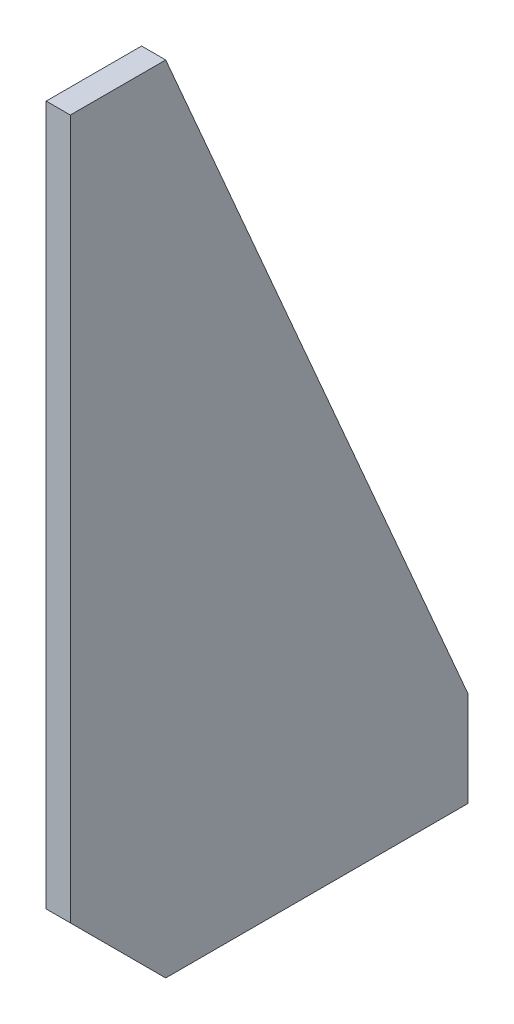
ISO-10303-21;
HEADER;
FILE_DESCRIPTION(('STEP AP214'),'2;1');
FILE_NAME('part.step','',(''),(''),'','','');
FILE_SCHEMA(('AUTOMOTIVE_DESIGN { 1 0 10303 214 1 1 1 1 }'));
ENDSEC;
DATA;
#1=APPLICATION_CONTEXT('core data for automotive mechanical design processes');
#2=APPLICATION_PROTOCOL_DEFINITION('international standard','automotive_design',2000,#1);
#3=PRODUCT_CONTEXT('',#1,'mechanical');
#4=PRODUCT('Part','Part','',(#3));
#5=PRODUCT_RELATED_PRODUCT_CATEGORY('part','',(#4));
#6=PRODUCT_DEFINITION_FORMATION('','',#4);
#7=PRODUCT_DEFINITION_CONTEXT('part definition',#1,'design');
#8=PRODUCT_DEFINITION('design','',#6,#7);
#9=PRODUCT_DEFINITION_SHAPE('','',#8);
#10=(LENGTH_UNIT() NAMED_UNIT(*) SI_UNIT(.MILLI.,.METRE.));
#11=(NAMED_UNIT(*) PLANE_ANGLE_UNIT() SI_UNIT($,.RADIAN.));
#12=(NAMED_UNIT(*) SI_UNIT($,.STERADIAN.) SOLID_ANGLE_UNIT());
#13=UNCERTAINTY_MEASURE_WITH_UNIT(LENGTH_MEASURE(1.E-05),#10,'distance_accuracy_value','');
#14=(GEOMETRIC_REPRESENTATION_CONTEXT(3) GLOBAL_UNCERTAINTY_ASSIGNED_CONTEXT((#13)) GLOBAL_UNIT_ASSIGNED_CONTEXT((#10,
#11,#12)) REPRESENTATION_CONTEXT('',''));
#15=CARTESIAN_POINT('',(0.,0.,0.));
#16=DIRECTION('',(0.,0.,1.));
#17=DIRECTION('',(1.,0.,0.));
#18=AXIS2_PLACEMENT_3D('',#15,#16,#17);
#19=CARTESIAN_POINT('',(-3.03784,0.,-50.));
#20=DIRECTION('',(0.,-1.,0.));
#21=DIRECTION('',(0.,0.,-1.));
#22=AXIS2_PLACEMENT_3D('',#19,#20,#21);
#23=PLANE('',#22);
#24=DIRECTION('',(0.,0.,-1.));
#25=VECTOR('',#24,1.);
#26=CARTESIAN_POINT('',(0.,0.,-50.));
#27=LINE('',#26,#25);
#28=CARTESIAN_POINT('',(0.,0.,-12.));
#29=VERTEX_POINT('',#28);
#30=CARTESIAN_POINT('',(0.,0.,-50.));
#31=VERTEX_POINT('',#30);
#32=EDGE_CURVE('E123',#29,#31,#27,.T.);
#33=ORIENTED_EDGE('',*,*,#32,.F.);
#34=DIRECTION('',(1.,0.,0.));
#35=VECTOR('',#34,1.);
#36=CARTESIAN_POINT('',(-3.03784,0.,-12.));
#37=LINE('',#36,#35);
#38=CARTESIAN_POINT('',(-3.03784,0.,-12.));
#39=VERTEX_POINT('',#38);
#40=EDGE_CURVE('E11',#39,#29,#37,.T.);
#41=ORIENTED_EDGE('',*,*,#40,.F.);
#42=DIRECTION('',(0.,0.,-1.));
#43=VECTOR('',#42,1.);
#44=CARTESIAN_POINT('',(-3.03784,0.,-50.));
#45=LINE('',#44,#43);
#46=CARTESIAN_POINT('',(-3.03784,0.,-50.));
#47=VERTEX_POINT('',#46);
#48=EDGE_CURVE('E137',#39,#47,#45,.T.);
#49=ORIENTED_EDGE('',*,*,#48,.T.);
#50=DIRECTION('',(1.,0.,0.));
#51=VECTOR('',#50,1.);
#52=CARTESIAN_POINT('',(-3.03784,0.,-50.));
#53=LINE('',#52,#51);
#54=EDGE_CURVE('E41',#47,#31,#53,.T.);
#55=ORIENTED_EDGE('',*,*,#54,.T.);
#56=EDGE_LOOP('',(#33,#41,#49,#55));
#57=FACE_BOUND('',#56,.T.);
#58=ADVANCED_FACE('F38',(#57),#23,.T.);
#59=CARTESIAN_POINT('',(-3.03784,0.,-12.));
#60=DIRECTION('',(0.,-0.707106781186547,0.707106781186548));
#61=DIRECTION('',(0.,-0.707106781186548,-0.707106781186547));
#62=AXIS2_PLACEMENT_3D('',#59,#60,#61);
#63=PLANE('',#62);
#64=DIRECTION('',(0.,-0.707106781186548,-0.707106781186547));
#65=VECTOR('',#64,1.);
#66=CARTESIAN_POINT('',(0.,0.,-12.));
#67=LINE('',#66,#65);
#68=CARTESIAN_POINT('',(0.,12.,0.));
#69=VERTEX_POINT('',#68);
#70=EDGE_CURVE('E135',#69,#29,#67,.T.);
#71=ORIENTED_EDGE('',*,*,#70,.F.);
#72=DIRECTION('',(1.,0.,0.));
#73=VECTOR('',#72,1.);
#74=CARTESIAN_POINT('',(-3.03784,12.,0.));
#75=LINE('',#74,#73);
#76=CARTESIAN_POINT('',(-3.03784,12.,0.));
#77=VERTEX_POINT('',#76);
#78=EDGE_CURVE('E47',#77,#69,#75,.T.);
#79=ORIENTED_EDGE('',*,*,#78,.F.);
#80=DIRECTION('',(0.,-0.707106781186548,-0.707106781186547));
#81=VECTOR('',#80,1.);
#82=CARTESIAN_POINT('',(-3.03784,0.,-12.));
#83=LINE('',#82,#81);
#84=EDGE_CURVE('E113',#77,#39,#83,.T.);
#85=ORIENTED_EDGE('',*,*,#84,.T.);
#86=ORIENTED_EDGE('',*,*,#40,.T.);
#87=EDGE_LOOP('',(#71,#79,#85,#86));
#88=FACE_BOUND('',#87,.T.);
#89=ADVANCED_FACE('F145',(#88),#63,.T.);
#90=CARTESIAN_POINT('',(-3.03784,12.,0.));
#91=DIRECTION('',(0.,0.,1.));
#92=DIRECTION('',(1.,0.,0.));
#93=AXIS2_PLACEMENT_3D('',#90,#91,#92);
#94=PLANE('',#93);
#95=DIRECTION('',(0.,-1.,0.));
#96=VECTOR('',#95,1.);
#97=CARTESIAN_POINT('',(0.,12.,0.));
#98=LINE('',#97,#96);
#99=CARTESIAN_POINT('',(0.,100.,0.));
#100=VERTEX_POINT('',#99);
#101=EDGE_CURVE('E100',#100,#69,#98,.T.);
#102=ORIENTED_EDGE('',*,*,#101,.F.);
#103=DIRECTION('',(1.,0.,0.));
#104=VECTOR('',#103,1.);
#105=CARTESIAN_POINT('',(-3.03784,100.,0.));
#106=LINE('',#105,#104);
#107=CARTESIAN_POINT('',(-3.03784,100.,0.));
#108=VERTEX_POINT('',#107);
#109=EDGE_CURVE('E95',#108,#100,#106,.T.);
#110=ORIENTED_EDGE('',*,*,#109,.F.);
#111=DIRECTION('',(0.,-1.,0.));
#112=VECTOR('',#111,1.);
#113=CARTESIAN_POINT('',(-3.03784,12.,0.));
#114=LINE('',#113,#112);
#115=EDGE_CURVE('E98',#108,#77,#114,.T.);
#116=ORIENTED_EDGE('',*,*,#115,.T.);
#117=ORIENTED_EDGE('',*,*,#78,.T.);
#118=EDGE_LOOP('',(#102,#110,#116,#117));
#119=FACE_BOUND('',#118,.T.);
#120=ADVANCED_FACE('F97',(#119),#94,.T.);
#121=CARTESIAN_POINT('',(-3.03784,100.,0.));
#122=DIRECTION('',(0.,1.,0.));
#123=DIRECTION('',(0.,0.,1.));
#124=AXIS2_PLACEMENT_3D('',#121,#122,#123);
#125=PLANE('',#124);
#126=DIRECTION('',(0.,0.,1.));
#127=VECTOR('',#126,1.);
#128=CARTESIAN_POINT('',(0.,100.,0.));
#129=LINE('',#128,#127);
#130=CARTESIAN_POINT('',(0.,100.,-12.));
#131=VERTEX_POINT('',#130);
#132=EDGE_CURVE('E132',#131,#100,#129,.T.);
#133=ORIENTED_EDGE('',*,*,#132,.F.);
#134=DIRECTION('',(1.,0.,0.));
#135=VECTOR('',#134,1.);
#136=CARTESIAN_POINT('',(-3.03784,100.,-12.));
#137=LINE('',#136,#135);
#138=CARTESIAN_POINT('',(-3.03784,100.,-12.));
#139=VERTEX_POINT('',#138);
#140=EDGE_CURVE('E105',#139,#131,#137,.T.);
#141=ORIENTED_EDGE('',*,*,#140,.F.);
#142=DIRECTION('',(0.,0.,1.));
#143=VECTOR('',#142,1.);
#144=CARTESIAN_POINT('',(-3.03784,100.,0.));
#145=LINE('',#144,#143);
#146=EDGE_CURVE('E111',#139,#108,#145,.T.);
#147=ORIENTED_EDGE('',*,*,#146,.T.);
#148=ORIENTED_EDGE('',*,*,#109,.T.);
#149=EDGE_LOOP('',(#133,#141,#147,#148));
#150=FACE_BOUND('',#149,.T.);
#151=ADVANCED_FACE('F115',(#150),#125,.T.);
#152=CARTESIAN_POINT('',(-3.03784,100.,-12.));
#153=DIRECTION('',(0.,0.396436016299719,-0.91806235353619));
#154=DIRECTION('',(0.,0.91806235353619,0.396436016299719));
#155=AXIS2_PLACEMENT_3D('',#152,#153,#154);
#156=PLANE('',#155);
#157=DIRECTION('',(0.,0.91806235353619,0.396436016299719));
#158=VECTOR('',#157,1.);
#159=CARTESIAN_POINT('',(0.,100.,-12.));
#160=LINE('',#159,#158);
#161=CARTESIAN_POINT('',(0.,12.,-50.));
#162=VERTEX_POINT('',#161);
#163=EDGE_CURVE('E129',#162,#131,#160,.T.);
#164=ORIENTED_EDGE('',*,*,#163,.F.);
#165=DIRECTION('',(1.,0.,0.));
#166=VECTOR('',#165,1.);
#167=CARTESIAN_POINT('',(-3.03784,12.,-50.));
#168=LINE('',#167,#166);
#169=CARTESIAN_POINT('',(-3.03784,12.,-50.));
#170=VERTEX_POINT('',#169);
#171=EDGE_CURVE('E140',#170,#162,#168,.T.);
#172=ORIENTED_EDGE('',*,*,#171,.F.);
#173=DIRECTION('',(0.,0.91806235353619,0.396436016299719));
#174=VECTOR('',#173,1.);
#175=CARTESIAN_POINT('',(-3.03784,100.,-12.));
#176=LINE('',#175,#174);
#177=EDGE_CURVE('E116',#170,#139,#176,.T.);
#178=ORIENTED_EDGE('',*,*,#177,.T.);
#179=ORIENTED_EDGE('',*,*,#140,.T.);
#180=EDGE_LOOP('',(#164,#172,#178,#179));
#181=FACE_BOUND('',#180,.T.);
#182=ADVANCED_FACE('F158',(#181),#156,.T.);
#183=CARTESIAN_POINT('',(-3.03784,12.,-50.));
#184=DIRECTION('',(0.,0.,-1.));
#185=DIRECTION('',(-1.,0.,0.));
#186=AXIS2_PLACEMENT_3D('',#183,#184,#185);
#187=PLANE('',#186);
#188=DIRECTION('',(0.,1.,0.));
#189=VECTOR('',#188,1.);
#190=CARTESIAN_POINT('',(0.,12.,-50.));
#191=LINE('',#190,#189);
#192=EDGE_CURVE('E126',#31,#162,#191,.T.);
#193=ORIENTED_EDGE('',*,*,#192,.F.);
#194=ORIENTED_EDGE('',*,*,#54,.F.);
#195=DIRECTION('',(0.,1.,0.));
#196=VECTOR('',#195,1.);
#197=CARTESIAN_POINT('',(-3.03784,12.,-50.));
#198=LINE('',#197,#196);
#199=EDGE_CURVE('E118',#47,#170,#198,.T.);
#200=ORIENTED_EDGE('',*,*,#199,.T.);
#201=ORIENTED_EDGE('',*,*,#171,.T.);
#202=EDGE_LOOP('',(#193,#194,#200,#201));
#203=FACE_BOUND('',#202,.T.);
#204=ADVANCED_FACE('F142',(#203),#187,.T.);
#205=CARTESIAN_POINT('',(-3.03784,0.,0.));
#206=DIRECTION('',(-1.,0.,0.));
#207=DIRECTION('',(0.,0.,1.));
#208=AXIS2_PLACEMENT_3D('',#205,#206,#207);
#209=PLANE('',#208);
#210=ORIENTED_EDGE('',*,*,#48,.F.);
#211=ORIENTED_EDGE('',*,*,#84,.F.);
#212=ORIENTED_EDGE('',*,*,#115,.F.);
#213=ORIENTED_EDGE('',*,*,#146,.F.);
#214=ORIENTED_EDGE('',*,*,#177,.F.);
#215=ORIENTED_EDGE('',*,*,#199,.F.);
#216=EDGE_LOOP('',(#210,#211,#212,#213,#214,#215));
#217=FACE_BOUND('',#216,.T.);
#218=ADVANCED_FACE('F109',(#217),#209,.T.);
#219=CARTESIAN_POINT('',(0.,0.,0.));
#220=DIRECTION('',(-1.,0.,0.));
#221=DIRECTION('',(0.,0.,1.));
#222=AXIS2_PLACEMENT_3D('',#219,#220,#221);
#223=PLANE('',#222);
#224=ORIENTED_EDGE('',*,*,#32,.T.);
#225=ORIENTED_EDGE('',*,*,#192,.T.);
#226=ORIENTED_EDGE('',*,*,#163,.T.);
#227=ORIENTED_EDGE('',*,*,#132,.T.);
#228=ORIENTED_EDGE('',*,*,#101,.T.);
#229=ORIENTED_EDGE('',*,*,#70,.T.);
#230=EDGE_LOOP('',(#224,#225,#226,#227,#228,#229));
#231=FACE_BOUND('',#230,.T.);
#232=ADVANCED_FACE('F144',(#231),#223,.F.);
#233=CLOSED_SHELL('',(#58,#89,#120,#151,#182,#204,#218,#232));
#234=MANIFOLD_SOLID_BREP('B2',#233);
#235=ADVANCED_BREP_SHAPE_REPRESENTATION('',(#18,#234),#14);
#236=SHAPE_DEFINITION_REPRESENTATION(#9,#235);
ENDSEC;
END-ISO-10303-21;
